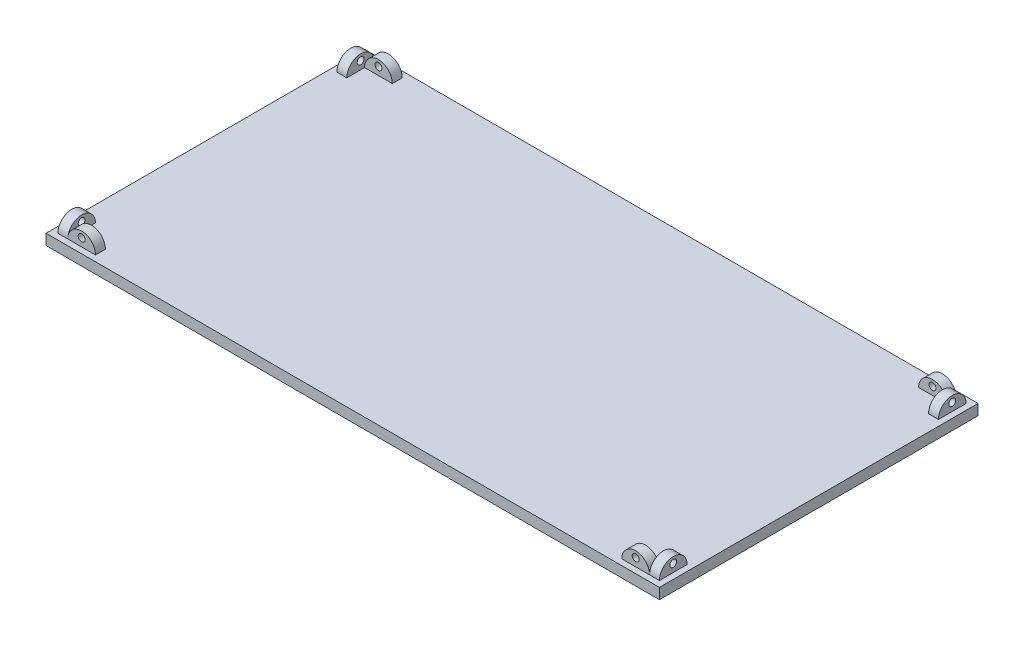
ISO-10303-21;
HEADER;
FILE_DESCRIPTION(('STEP AP214'),'2;1');
FILE_NAME('part.step','',(''),(''),'','','');
FILE_SCHEMA(('AUTOMOTIVE_DESIGN { 1 0 10303 214 1 1 1 1 }'));
ENDSEC;
DATA;
#1=APPLICATION_CONTEXT('core data for automotive mechanical design processes');
#2=APPLICATION_PROTOCOL_DEFINITION('international standard','automotive_design',2000,#1);
#3=PRODUCT_CONTEXT('',#1,'mechanical');
#4=PRODUCT('Part','Part','',(#3));
#5=PRODUCT_RELATED_PRODUCT_CATEGORY('part','',(#4));
#6=PRODUCT_DEFINITION_FORMATION('','',#4);
#7=PRODUCT_DEFINITION_CONTEXT('part definition',#1,'design');
#8=PRODUCT_DEFINITION('design','',#6,#7);
#9=PRODUCT_DEFINITION_SHAPE('','',#8);
#10=(LENGTH_UNIT() NAMED_UNIT(*) SI_UNIT(.MILLI.,.METRE.));
#11=(NAMED_UNIT(*) PLANE_ANGLE_UNIT() SI_UNIT($,.RADIAN.));
#12=(NAMED_UNIT(*) SI_UNIT($,.STERADIAN.) SOLID_ANGLE_UNIT());
#13=UNCERTAINTY_MEASURE_WITH_UNIT(LENGTH_MEASURE(1.E-05),#10,'distance_accuracy_value','');
#14=(GEOMETRIC_REPRESENTATION_CONTEXT(3) GLOBAL_UNCERTAINTY_ASSIGNED_CONTEXT((#13)) GLOBAL_UNIT_ASSIGNED_CONTEXT((#10,
#11,#12)) REPRESENTATION_CONTEXT('',''));
#15=CARTESIAN_POINT('',(0.,0.,0.));
#16=DIRECTION('',(0.,0.,1.));
#17=DIRECTION('',(1.,0.,0.));
#18=AXIS2_PLACEMENT_3D('',#15,#16,#17);
#19=CARTESIAN_POINT('',(0.,0.,0.));
#20=DIRECTION('',(0.,-1.,0.));
#21=DIRECTION('',(0.,0.,-1.));
#22=AXIS2_PLACEMENT_3D('',#19,#20,#21);
#23=PLANE('',#22);
#24=DIRECTION('',(-1.,0.,0.));
#25=VECTOR('',#24,1.);
#26=CARTESIAN_POINT('',(1.87123665779043,0.,-71.114281477171));
#27=LINE('',#26,#25);
#28=CARTESIAN_POINT('',(147.935618328895,0.,-71.114281477171));
#29=VERTEX_POINT('',#28);
#30=CARTESIAN_POINT('',(133.935618328895,0.,-71.114281477171));
#31=VERTEX_POINT('',#30);
#32=EDGE_CURVE('E551',#29,#31,#27,.T.);
#33=ORIENTED_EDGE('',*,*,#32,.T.);
#34=DIRECTION('',(0.,0.,-1.));
#35=VECTOR('',#34,1.);
#36=CARTESIAN_POINT('',(133.935618328895,0.,-71.114281477171));
#37=LINE('',#36,#35);
#38=CARTESIAN_POINT('',(133.935618328895,0.,-76.1142814771711));
#39=VERTEX_POINT('',#38);
#40=EDGE_CURVE('E565',#31,#39,#37,.T.);
#41=ORIENTED_EDGE('',*,*,#40,.T.);
#42=DIRECTION('',(-1.,0.,0.));
#43=VECTOR('',#42,1.);
#44=CARTESIAN_POINT('',(1.87123665779043,0.,-76.1142814771711));
#45=LINE('',#44,#43);
#46=CARTESIAN_POINT('',(147.935618328895,0.,-76.1142814771711));
#47=VERTEX_POINT('',#46);
#48=EDGE_CURVE('E547',#47,#39,#45,.T.);
#49=ORIENTED_EDGE('',*,*,#48,.F.);
#50=DIRECTION('',(1.,0.,0.));
#51=VECTOR('',#50,1.);
#52=CARTESIAN_POINT('',(147.935618328895,0.,-76.1142814771709));
#53=LINE('',#52,#51);
#54=CARTESIAN_POINT('',(152.935618328895,0.,-76.1142814771709));
#55=VERTEX_POINT('',#54);
#56=EDGE_CURVE('E599',#47,#55,#53,.T.);
#57=ORIENTED_EDGE('',*,*,#56,.T.);
#58=DIRECTION('',(0.,0.,-1.));
#59=VECTOR('',#58,1.);
#60=CARTESIAN_POINT('',(152.935618328895,0.,-62.1142814771709));
#61=LINE('',#60,#59);
#62=CARTESIAN_POINT('',(152.935618328895,0.,-62.1142814771709));
#63=VERTEX_POINT('',#62);
#64=EDGE_CURVE('E585',#63,#55,#61,.T.);
#65=ORIENTED_EDGE('',*,*,#64,.F.);
#66=DIRECTION('',(1.,0.,0.));
#67=VECTOR('',#66,1.);
#68=CARTESIAN_POINT('',(147.935618328895,0.,-62.1142814771709));
#69=LINE('',#68,#67);
#70=CARTESIAN_POINT('',(147.935618328895,0.,-62.1142814771709));
#71=VERTEX_POINT('',#70);
#72=EDGE_CURVE('E589',#71,#63,#69,.T.);
#73=ORIENTED_EDGE('',*,*,#72,.F.);
#74=DIRECTION('',(0.,0.,-1.));
#75=VECTOR('',#74,1.);
#76=CARTESIAN_POINT('',(147.935618328895,0.,-62.1142814771709));
#77=LINE('',#76,#75);
#78=EDGE_CURVE('E584',#71,#29,#77,.T.);
#79=ORIENTED_EDGE('',*,*,#78,.T.);
#80=EDGE_LOOP('',(#33,#41,#49,#57,#65,#73,#79));
#81=FACE_BOUND('',#80,.T.);
#82=DIRECTION('',(1.,0.,0.));
#83=VECTOR('',#82,1.);
#84=CARTESIAN_POINT('',(0.,0.,73.8857185228291));
#85=LINE('',#84,#83);
#86=CARTESIAN_POINT('',(-146.064381671105,0.,73.8857185228291));
#87=VERTEX_POINT('',#86);
#88=CARTESIAN_POINT('',(-132.064381671105,0.,73.8857185228291));
#89=VERTEX_POINT('',#88);
#90=EDGE_CURVE('E250',#87,#89,#85,.T.);
#91=ORIENTED_EDGE('',*,*,#90,.T.);
#92=DIRECTION('',(0.,0.,1.));
#93=VECTOR('',#92,1.);
#94=CARTESIAN_POINT('',(-132.064381671105,0.,73.8857185228291));
#95=LINE('',#94,#93);
#96=CARTESIAN_POINT('',(-132.064381671105,0.,78.8857185228291));
#97=VERTEX_POINT('',#96);
#98=EDGE_CURVE('E254',#89,#97,#95,.T.);
#99=ORIENTED_EDGE('',*,*,#98,.T.);
#100=DIRECTION('',(1.,0.,0.));
#101=VECTOR('',#100,1.);
#102=CARTESIAN_POINT('',(0.,0.,78.8857185228291));
#103=LINE('',#102,#101);
#104=CARTESIAN_POINT('',(-146.064381671105,0.,78.8857185228291));
#105=VERTEX_POINT('',#104);
#106=EDGE_CURVE('E246',#105,#97,#103,.T.);
#107=ORIENTED_EDGE('',*,*,#106,.F.);
#108=DIRECTION('',(-1.,0.,0.));
#109=VECTOR('',#108,1.);
#110=CARTESIAN_POINT('',(-146.064381671105,0.,78.8857185228291));
#111=LINE('',#110,#109);
#112=CARTESIAN_POINT('',(-151.064381671105,0.,78.8857185228291));
#113=VERTEX_POINT('',#112);
#114=EDGE_CURVE('E326',#105,#113,#111,.T.);
#115=ORIENTED_EDGE('',*,*,#114,.T.);
#116=DIRECTION('',(0.,0.,-1.));
#117=VECTOR('',#116,1.);
#118=CARTESIAN_POINT('',(-151.064381671105,0.,78.8857185228291));
#119=LINE('',#118,#117);
#120=CARTESIAN_POINT('',(-151.064381671105,0.,64.8857185228291));
#121=VERTEX_POINT('',#120);
#122=EDGE_CURVE('E312',#113,#121,#119,.T.);
#123=ORIENTED_EDGE('',*,*,#122,.T.);
#124=DIRECTION('',(-1.,0.,0.));
#125=VECTOR('',#124,1.);
#126=CARTESIAN_POINT('',(-146.064381671105,0.,64.8857185228291));
#127=LINE('',#126,#125);
#128=CARTESIAN_POINT('',(-146.064381671105,0.,64.8857185228291));
#129=VERTEX_POINT('',#128);
#130=EDGE_CURVE('E317',#129,#121,#127,.T.);
#131=ORIENTED_EDGE('',*,*,#130,.F.);
#132=DIRECTION('',(0.,0.,-1.));
#133=VECTOR('',#132,1.);
#134=CARTESIAN_POINT('',(-146.064381671105,0.,78.8857185228291));
#135=LINE('',#134,#133);
#136=EDGE_CURVE('E311',#87,#129,#135,.T.);
#137=ORIENTED_EDGE('',*,*,#136,.F.);
#138=EDGE_LOOP('',(#91,#99,#107,#115,#123,#131,#137));
#139=FACE_BOUND('',#138,.T.);
#140=DIRECTION('',(0.,0.,1.));
#141=VECTOR('',#140,1.);
#142=CARTESIAN_POINT('',(-154.064381671105,0.,81.8857185228291));
#143=LINE('',#142,#141);
#144=CARTESIAN_POINT('',(-154.064381671105,0.,-79.1142814771709));
#145=VERTEX_POINT('',#144);
#146=CARTESIAN_POINT('',(-154.064381671105,0.,81.8857185228291));
#147=VERTEX_POINT('',#146);
#148=EDGE_CURVE('E329',#145,#147,#143,.T.);
#149=ORIENTED_EDGE('',*,*,#148,.T.);
#150=DIRECTION('',(1.,0.,0.));
#151=VECTOR('',#150,1.);
#152=CARTESIAN_POINT('',(-154.064381671105,0.,81.8857185228291));
#153=LINE('',#152,#151);
#154=CARTESIAN_POINT('',(155.935618328895,0.,81.8857185228292));
#155=VERTEX_POINT('',#154);
#156=EDGE_CURVE('E350',#147,#155,#153,.T.);
#157=ORIENTED_EDGE('',*,*,#156,.T.);
#158=DIRECTION('',(0.,0.,-1.));
#159=VECTOR('',#158,1.);
#160=CARTESIAN_POINT('',(155.935618328895,0.,81.8857185228292));
#161=LINE('',#160,#159);
#162=CARTESIAN_POINT('',(155.935618328895,0.,-79.114281477171));
#163=VERTEX_POINT('',#162);
#164=EDGE_CURVE('E354',#155,#163,#161,.T.);
#165=ORIENTED_EDGE('',*,*,#164,.T.);
#166=DIRECTION('',(-1.,0.,0.));
#167=VECTOR('',#166,1.);
#168=CARTESIAN_POINT('',(-154.064381671105,0.,-79.1142814771709));
#169=LINE('',#168,#167);
#170=EDGE_CURVE('E335',#163,#145,#169,.T.);
#171=ORIENTED_EDGE('',*,*,#170,.T.);
#172=EDGE_LOOP('',(#149,#157,#165,#171));
#173=FACE_BOUND('',#172,.T.);
#174=DIRECTION('',(1.,0.,0.));
#175=VECTOR('',#174,1.);
#176=CARTESIAN_POINT('',(0.,0.,-71.114281477171));
#177=LINE('',#176,#175);
#178=CARTESIAN_POINT('',(-146.064381671105,0.,-71.114281477171));
#179=VERTEX_POINT('',#178);
#180=CARTESIAN_POINT('',(-132.064381671105,0.,-71.114281477171));
#181=VERTEX_POINT('',#180);
#182=EDGE_CURVE('E221',#179,#181,#177,.T.);
#183=ORIENTED_EDGE('',*,*,#182,.F.);
#184=DIRECTION('',(0.,0.,-1.));
#185=VECTOR('',#184,1.);
#186=CARTESIAN_POINT('',(-146.064381671105,0.,-62.1142814771709));
#187=LINE('',#186,#185);
#188=CARTESIAN_POINT('',(-146.064381671105,0.,-62.1142814771709));
#189=VERTEX_POINT('',#188);
#190=EDGE_CURVE('E281',#189,#179,#187,.T.);
#191=ORIENTED_EDGE('',*,*,#190,.F.);
#192=DIRECTION('',(-1.,0.,0.));
#193=VECTOR('',#192,1.);
#194=CARTESIAN_POINT('',(-146.064381671105,0.,-62.1142814771709));
#195=LINE('',#194,#193);
#196=CARTESIAN_POINT('',(-151.064381671105,0.,-62.1142814771709));
#197=VERTEX_POINT('',#196);
#198=EDGE_CURVE('E295',#189,#197,#195,.T.);
#199=ORIENTED_EDGE('',*,*,#198,.T.);
#200=DIRECTION('',(0.,0.,-1.));
#201=VECTOR('',#200,1.);
#202=CARTESIAN_POINT('',(-151.064381671105,0.,-62.1142814771709));
#203=LINE('',#202,#201);
#204=CARTESIAN_POINT('',(-151.064381671105,0.,-76.1142814771709));
#205=VERTEX_POINT('',#204);
#206=EDGE_CURVE('E282',#197,#205,#203,.T.);
#207=ORIENTED_EDGE('',*,*,#206,.T.);
#208=DIRECTION('',(-1.,0.,0.));
#209=VECTOR('',#208,1.);
#210=CARTESIAN_POINT('',(-146.064381671105,0.,-76.1142814771709));
#211=LINE('',#210,#209);
#212=CARTESIAN_POINT('',(-146.064381671105,0.,-76.1142814771709));
#213=VERTEX_POINT('',#212);
#214=EDGE_CURVE('E286',#213,#205,#211,.T.);
#215=ORIENTED_EDGE('',*,*,#214,.F.);
#216=DIRECTION('',(1.,0.,0.));
#217=VECTOR('',#216,1.);
#218=CARTESIAN_POINT('',(0.,0.,-76.1142814771711));
#219=LINE('',#218,#217);
#220=CARTESIAN_POINT('',(-132.064381671105,0.,-76.1142814771711));
#221=VERTEX_POINT('',#220);
#222=EDGE_CURVE('E218',#213,#221,#219,.T.);
#223=ORIENTED_EDGE('',*,*,#222,.T.);
#224=DIRECTION('',(0.,0.,-1.));
#225=VECTOR('',#224,1.);
#226=CARTESIAN_POINT('',(-132.064381671105,0.,-71.114281477171));
#227=LINE('',#226,#225);
#228=EDGE_CURVE('E224',#181,#221,#227,.T.);
#229=ORIENTED_EDGE('',*,*,#228,.F.);
#230=EDGE_LOOP('',(#183,#191,#199,#207,#215,#223,#229));
#231=FACE_BOUND('',#230,.T.);
#232=DIRECTION('',(-1.,0.,0.));
#233=VECTOR('',#232,1.);
#234=CARTESIAN_POINT('',(1.87123665779043,0.,73.8857185228291));
#235=LINE('',#234,#233);
#236=CARTESIAN_POINT('',(147.935618328895,0.,73.8857185228291));
#237=VERTEX_POINT('',#236);
#238=CARTESIAN_POINT('',(133.935618328895,0.,73.8857185228291));
#239=VERTEX_POINT('',#238);
#240=EDGE_CURVE('E176',#237,#239,#235,.T.);
#241=ORIENTED_EDGE('',*,*,#240,.F.);
#242=DIRECTION('',(0.,0.,-1.));
#243=VECTOR('',#242,1.);
#244=CARTESIAN_POINT('',(147.935618328895,0.,78.8857185228291));
#245=LINE('',#244,#243);
#246=CARTESIAN_POINT('',(147.935618328895,0.,64.8857185228291));
#247=VERTEX_POINT('',#246);
#248=EDGE_CURVE('E167',#237,#247,#245,.T.);
#249=ORIENTED_EDGE('',*,*,#248,.T.);
#250=DIRECTION('',(1.,0.,0.));
#251=VECTOR('',#250,1.);
#252=CARTESIAN_POINT('',(147.935618328895,0.,64.8857185228291));
#253=LINE('',#252,#251);
#254=CARTESIAN_POINT('',(152.935618328895,0.,64.8857185228291));
#255=VERTEX_POINT('',#254);
#256=EDGE_CURVE('E196',#247,#255,#253,.T.);
#257=ORIENTED_EDGE('',*,*,#256,.T.);
#258=DIRECTION('',(0.,0.,-1.));
#259=VECTOR('',#258,1.);
#260=CARTESIAN_POINT('',(152.935618328895,0.,78.8857185228291));
#261=LINE('',#260,#259);
#262=CARTESIAN_POINT('',(152.935618328895,0.,78.8857185228291));
#263=VERTEX_POINT('',#262);
#264=EDGE_CURVE('E205',#263,#255,#261,.T.);
#265=ORIENTED_EDGE('',*,*,#264,.F.);
#266=DIRECTION('',(1.,0.,0.));
#267=VECTOR('',#266,1.);
#268=CARTESIAN_POINT('',(147.935618328895,0.,78.8857185228291));
#269=LINE('',#268,#267);
#270=CARTESIAN_POINT('',(147.935618328895,0.,78.8857185228291));
#271=VERTEX_POINT('',#270);
#272=EDGE_CURVE('E193',#271,#263,#269,.T.);
#273=ORIENTED_EDGE('',*,*,#272,.F.);
#274=DIRECTION('',(-1.,0.,0.));
#275=VECTOR('',#274,1.);
#276=CARTESIAN_POINT('',(1.87123665779043,0.,78.8857185228291));
#277=LINE('',#276,#275);
#278=CARTESIAN_POINT('',(133.935618328895,0.,78.8857185228291));
#279=VERTEX_POINT('',#278);
#280=EDGE_CURVE('E64',#271,#279,#277,.T.);
#281=ORIENTED_EDGE('',*,*,#280,.T.);
#282=DIRECTION('',(0.,0.,1.));
#283=VECTOR('',#282,1.);
#284=CARTESIAN_POINT('',(133.935618328895,0.,73.8857185228291));
#285=LINE('',#284,#283);
#286=EDGE_CURVE('E59',#239,#279,#285,.T.);
#287=ORIENTED_EDGE('',*,*,#286,.F.);
#288=EDGE_LOOP('',(#241,#249,#257,#265,#273,#281,#287));
#289=FACE_BOUND('',#288,.T.);
#290=ADVANCED_FACE('F41',(#81,#139,#173,#231,#289),#23,.F.);
#291=CARTESIAN_POINT('',(-154.064381671105,-5.4,81.8857185228291));
#292=DIRECTION('',(-1.,0.,0.));
#293=DIRECTION('',(0.,0.,1.));
#294=AXIS2_PLACEMENT_3D('',#291,#292,#293);
#295=PLANE('',#294);
#296=ORIENTED_EDGE('',*,*,#148,.F.);
#297=DIRECTION('',(0.,1.,0.));
#298=VECTOR('',#297,1.);
#299=CARTESIAN_POINT('',(-154.064381671105,-5.4,-79.1142814771709));
#300=LINE('',#299,#298);
#301=CARTESIAN_POINT('',(-154.064381671105,-5.4,-79.1142814771709));
#302=VERTEX_POINT('',#301);
#303=EDGE_CURVE('E11',#302,#145,#300,.T.);
#304=ORIENTED_EDGE('',*,*,#303,.F.);
#305=DIRECTION('',(0.,0.,1.));
#306=VECTOR('',#305,1.);
#307=CARTESIAN_POINT('',(-154.064381671105,-5.4,81.8857185228291));
#308=LINE('',#307,#306);
#309=CARTESIAN_POINT('',(-154.064381671105,-5.4,81.8857185228291));
#310=VERTEX_POINT('',#309);
#311=EDGE_CURVE('E330',#302,#310,#308,.T.);
#312=ORIENTED_EDGE('',*,*,#311,.T.);
#313=DIRECTION('',(0.,1.,0.));
#314=VECTOR('',#313,1.);
#315=CARTESIAN_POINT('',(-154.064381671105,-5.4,81.8857185228291));
#316=LINE('',#315,#314);
#317=EDGE_CURVE('E45',#310,#147,#316,.T.);
#318=ORIENTED_EDGE('',*,*,#317,.T.);
#319=EDGE_LOOP('',(#296,#304,#312,#318));
#320=FACE_BOUND('',#319,.T.);
#321=ADVANCED_FACE('F43',(#320),#295,.T.);
#322=CARTESIAN_POINT('',(-154.064381671105,-5.4,-79.1142814771709));
#323=DIRECTION('',(0.,0.,-1.));
#324=DIRECTION('',(-1.,0.,0.));
#325=AXIS2_PLACEMENT_3D('',#322,#323,#324);
#326=PLANE('',#325);
#327=ORIENTED_EDGE('',*,*,#170,.F.);
#328=DIRECTION('',(0.,1.,0.));
#329=VECTOR('',#328,1.);
#330=CARTESIAN_POINT('',(155.935618328895,-5.4,-79.114281477171));
#331=LINE('',#330,#329);
#332=CARTESIAN_POINT('',(155.935618328895,-5.4,-79.114281477171));
#333=VERTEX_POINT('',#332);
#334=EDGE_CURVE('E51',#333,#163,#331,.T.);
#335=ORIENTED_EDGE('',*,*,#334,.F.);
#336=DIRECTION('',(-1.,0.,0.));
#337=VECTOR('',#336,1.);
#338=CARTESIAN_POINT('',(-154.064381671105,-5.4,-79.1142814771709));
#339=LINE('',#338,#337);
#340=EDGE_CURVE('E343',#333,#302,#339,.T.);
#341=ORIENTED_EDGE('',*,*,#340,.T.);
#342=ORIENTED_EDGE('',*,*,#303,.T.);
#343=EDGE_LOOP('',(#327,#335,#341,#342));
#344=FACE_BOUND('',#343,.T.);
#345=ADVANCED_FACE('F377',(#344),#326,.T.);
#346=CARTESIAN_POINT('',(155.935618328895,-5.4,81.8857185228292));
#347=DIRECTION('',(1.,0.,0.));
#348=DIRECTION('',(0.,0.,-1.));
#349=AXIS2_PLACEMENT_3D('',#346,#347,#348);
#350=PLANE('',#349);
#351=ORIENTED_EDGE('',*,*,#164,.F.);
#352=DIRECTION('',(0.,1.,0.));
#353=VECTOR('',#352,1.);
#354=CARTESIAN_POINT('',(155.935618328895,-5.4,81.8857185228292));
#355=LINE('',#354,#353);
#356=CARTESIAN_POINT('',(155.935618328895,-5.4,81.8857185228292));
#357=VERTEX_POINT('',#356);
#358=EDGE_CURVE('E362',#357,#155,#355,.T.);
#359=ORIENTED_EDGE('',*,*,#358,.F.);
#360=DIRECTION('',(0.,0.,-1.));
#361=VECTOR('',#360,1.);
#362=CARTESIAN_POINT('',(155.935618328895,-5.4,81.8857185228292));
#363=LINE('',#362,#361);
#364=EDGE_CURVE('E339',#357,#333,#363,.T.);
#365=ORIENTED_EDGE('',*,*,#364,.T.);
#366=ORIENTED_EDGE('',*,*,#334,.T.);
#367=EDGE_LOOP('',(#351,#359,#365,#366));
#368=FACE_BOUND('',#367,.T.);
#369=ADVANCED_FACE('F383',(#368),#350,.T.);
#370=CARTESIAN_POINT('',(-154.064381671105,-5.4,81.8857185228291));
#371=DIRECTION('',(0.,0.,1.));
#372=DIRECTION('',(1.,0.,0.));
#373=AXIS2_PLACEMENT_3D('',#370,#371,#372);
#374=PLANE('',#373);
#375=ORIENTED_EDGE('',*,*,#156,.F.);
#376=ORIENTED_EDGE('',*,*,#317,.F.);
#377=DIRECTION('',(1.,0.,0.));
#378=VECTOR('',#377,1.);
#379=CARTESIAN_POINT('',(-154.064381671105,-5.4,81.8857185228291));
#380=LINE('',#379,#378);
#381=EDGE_CURVE('E334',#310,#357,#380,.T.);
#382=ORIENTED_EDGE('',*,*,#381,.T.);
#383=ORIENTED_EDGE('',*,*,#358,.T.);
#384=EDGE_LOOP('',(#375,#376,#382,#383));
#385=FACE_BOUND('',#384,.T.);
#386=ADVANCED_FACE('F372',(#385),#374,.T.);
#387=CARTESIAN_POINT('',(0.,-5.4,0.));
#388=DIRECTION('',(0.,-1.,0.));
#389=DIRECTION('',(0.,0.,-1.));
#390=AXIS2_PLACEMENT_3D('',#387,#388,#389);
#391=PLANE('',#390);
#392=ORIENTED_EDGE('',*,*,#311,.F.);
#393=ORIENTED_EDGE('',*,*,#340,.F.);
#394=ORIENTED_EDGE('',*,*,#364,.F.);
#395=ORIENTED_EDGE('',*,*,#381,.F.);
#396=EDGE_LOOP('',(#392,#393,#394,#395));
#397=FACE_BOUND('',#396,.T.);
#398=ADVANCED_FACE('F380',(#397),#391,.T.);
#399=CARTESIAN_POINT('',(-146.064381671105,0.,71.8857185228291));
#400=DIRECTION('',(1.,0.,0.));
#401=DIRECTION('',(0.,0.,-1.));
#402=AXIS2_PLACEMENT_3D('',#399,#400,#401);
#403=PLANE('',#402);
#404=CARTESIAN_POINT('',(-146.064381671105,0.,71.8857185228291));
#405=DIRECTION('',(1.,0.,0.));
#406=DIRECTION('',(0.,0.,-1.));
#407=AXIS2_PLACEMENT_3D('',#404,#405,#406);
#408=CIRCLE('',#407,7.);
#409=EDGE_CURVE('E307',#129,#105,#408,.T.);
#410=ORIENTED_EDGE('',*,*,#409,.T.);
#411=EDGE_CURVE('E313',#105,#87,#135,.T.);
#412=ORIENTED_EDGE('',*,*,#411,.T.);
#413=ORIENTED_EDGE('',*,*,#136,.T.);
#414=EDGE_LOOP('',(#410,#412,#413));
#415=FACE_BOUND('',#414,.T.);
#416=CARTESIAN_POINT('',(-146.064381671105,4.,71.8857185228291));
#417=DIRECTION('',(1.,0.,0.));
#418=DIRECTION('',(0.,0.,-1.));
#419=AXIS2_PLACEMENT_3D('',#416,#417,#418);
#420=CIRCLE('',#419,1.75);
#421=CARTESIAN_POINT('',(-146.064381671105,4.,70.1357185228291));
#422=VERTEX_POINT('',#421);
#423=EDGE_CURVE('E299',#422,#422,#420,.T.);
#424=ORIENTED_EDGE('',*,*,#423,.F.);
#425=EDGE_LOOP('',(#424));
#426=FACE_BOUND('',#425,.T.);
#427=ADVANCED_FACE('F401',(#415,#426),#403,.T.);
#428=CARTESIAN_POINT('',(-151.064381671105,0.,71.8857185228291));
#429=DIRECTION('',(1.,0.,0.));
#430=DIRECTION('',(0.,0.,-1.));
#431=AXIS2_PLACEMENT_3D('',#428,#429,#430);
#432=PLANE('',#431);
#433=CARTESIAN_POINT('',(-151.064381671105,0.,71.8857185228291));
#434=DIRECTION('',(1.,0.,0.));
#435=DIRECTION('',(0.,0.,-1.));
#436=AXIS2_PLACEMENT_3D('',#433,#434,#435);
#437=CIRCLE('',#436,7.);
#438=EDGE_CURVE('E303',#121,#113,#437,.T.);
#439=ORIENTED_EDGE('',*,*,#438,.F.);
#440=ORIENTED_EDGE('',*,*,#122,.F.);
#441=EDGE_LOOP('',(#439,#440));
#442=FACE_BOUND('',#441,.T.);
#443=CARTESIAN_POINT('',(-151.064381671105,4.,71.8857185228291));
#444=DIRECTION('',(1.,0.,0.));
#445=DIRECTION('',(0.,0.,-1.));
#446=AXIS2_PLACEMENT_3D('',#443,#444,#445);
#447=CIRCLE('',#446,1.75);
#448=CARTESIAN_POINT('',(-151.064381671105,4.,70.1357185228291));
#449=VERTEX_POINT('',#448);
#450=EDGE_CURVE('E298',#449,#449,#447,.T.);
#451=ORIENTED_EDGE('',*,*,#450,.T.);
#452=EDGE_LOOP('',(#451));
#453=FACE_BOUND('',#452,.T.);
#454=ADVANCED_FACE('F406',(#442,#453),#432,.F.);
#455=CARTESIAN_POINT('',(-146.064381671105,0.,71.8857185228291));
#456=DIRECTION('',(-1.,0.,0.));
#457=DIRECTION('',(0.,0.,1.));
#458=AXIS2_PLACEMENT_3D('',#455,#456,#457);
#459=CYLINDRICAL_SURFACE('',#458,7.);
#460=ORIENTED_EDGE('',*,*,#438,.T.);
#461=ORIENTED_EDGE('',*,*,#114,.F.);
#462=ORIENTED_EDGE('',*,*,#409,.F.);
#463=ORIENTED_EDGE('',*,*,#130,.T.);
#464=EDGE_LOOP('',(#460,#461,#462,#463));
#465=FACE_BOUND('',#464,.T.);
#466=ADVANCED_FACE('F402',(#465),#459,.T.);
#467=CARTESIAN_POINT('',(-146.064381671105,4.,71.8857185228291));
#468=DIRECTION('',(-1.,0.,0.));
#469=DIRECTION('',(0.,0.,1.));
#470=AXIS2_PLACEMENT_3D('',#467,#468,#469);
#471=CYLINDRICAL_SURFACE('',#470,1.75);
#472=ORIENTED_EDGE('',*,*,#423,.T.);
#473=EDGE_LOOP('',(#472));
#474=FACE_BOUND('',#473,.T.);
#475=ORIENTED_EDGE('',*,*,#450,.F.);
#476=EDGE_LOOP('',(#475));
#477=FACE_BOUND('',#476,.T.);
#478=ADVANCED_FACE('F405',(#474,#477),#471,.F.);
#479=CARTESIAN_POINT('',(-146.064381671105,0.,-69.1142814771709));
#480=DIRECTION('',(1.,0.,0.));
#481=DIRECTION('',(0.,0.,-1.));
#482=AXIS2_PLACEMENT_3D('',#479,#480,#481);
#483=PLANE('',#482);
#484=CARTESIAN_POINT('',(-146.064381671105,0.,-69.1142814771709));
#485=DIRECTION('',(1.,0.,0.));
#486=DIRECTION('',(0.,0.,-1.));
#487=AXIS2_PLACEMENT_3D('',#484,#485,#486);
#488=CIRCLE('',#487,7.);
#489=EDGE_CURVE('E277',#213,#189,#488,.T.);
#490=ORIENTED_EDGE('',*,*,#489,.T.);
#491=ORIENTED_EDGE('',*,*,#190,.T.);
#492=DIRECTION('',(0.,0.,-1.));
#493=VECTOR('',#492,1.);
#494=CARTESIAN_POINT('',(-146.064381671105,0.,-71.114281477171));
#495=LINE('',#494,#493);
#496=EDGE_CURVE('E234',#179,#213,#495,.T.);
#497=ORIENTED_EDGE('',*,*,#496,.T.);
#498=EDGE_LOOP('',(#490,#491,#497));
#499=FACE_BOUND('',#498,.T.);
#500=CARTESIAN_POINT('',(-146.064381671105,4.,-69.1142814771709));
#501=DIRECTION('',(1.,0.,0.));
#502=DIRECTION('',(0.,0.,-1.));
#503=AXIS2_PLACEMENT_3D('',#500,#501,#502);
#504=CIRCLE('',#503,1.75);
#505=CARTESIAN_POINT('',(-146.064381671105,4.,-70.8642814771709));
#506=VERTEX_POINT('',#505);
#507=EDGE_CURVE('E269',#506,#506,#504,.T.);
#508=ORIENTED_EDGE('',*,*,#507,.F.);
#509=EDGE_LOOP('',(#508));
#510=FACE_BOUND('',#509,.T.);
#511=ADVANCED_FACE('F416',(#499,#510),#483,.T.);
#512=CARTESIAN_POINT('',(-151.064381671105,0.,-69.1142814771709));
#513=DIRECTION('',(1.,0.,0.));
#514=DIRECTION('',(0.,0.,-1.));
#515=AXIS2_PLACEMENT_3D('',#512,#513,#514);
#516=PLANE('',#515);
#517=CARTESIAN_POINT('',(-151.064381671105,0.,-69.1142814771709));
#518=DIRECTION('',(1.,0.,0.));
#519=DIRECTION('',(0.,0.,-1.));
#520=AXIS2_PLACEMENT_3D('',#517,#518,#519);
#521=CIRCLE('',#520,7.);
#522=EDGE_CURVE('E273',#205,#197,#521,.T.);
#523=ORIENTED_EDGE('',*,*,#522,.F.);
#524=ORIENTED_EDGE('',*,*,#206,.F.);
#525=EDGE_LOOP('',(#523,#524));
#526=FACE_BOUND('',#525,.T.);
#527=CARTESIAN_POINT('',(-151.064381671105,4.,-69.1142814771709));
#528=DIRECTION('',(1.,0.,0.));
#529=DIRECTION('',(0.,0.,-1.));
#530=AXIS2_PLACEMENT_3D('',#527,#528,#529);
#531=CIRCLE('',#530,1.75);
#532=CARTESIAN_POINT('',(-151.064381671105,4.,-70.8642814771709));
#533=VERTEX_POINT('',#532);
#534=EDGE_CURVE('E268',#533,#533,#531,.T.);
#535=ORIENTED_EDGE('',*,*,#534,.T.);
#536=EDGE_LOOP('',(#535));
#537=FACE_BOUND('',#536,.T.);
#538=ADVANCED_FACE('F422',(#526,#537),#516,.F.);
#539=CARTESIAN_POINT('',(-146.064381671105,0.,-69.1142814771709));
#540=DIRECTION('',(-1.,0.,0.));
#541=DIRECTION('',(0.,0.,1.));
#542=AXIS2_PLACEMENT_3D('',#539,#540,#541);
#543=CYLINDRICAL_SURFACE('',#542,7.);
#544=ORIENTED_EDGE('',*,*,#522,.T.);
#545=ORIENTED_EDGE('',*,*,#198,.F.);
#546=ORIENTED_EDGE('',*,*,#489,.F.);
#547=ORIENTED_EDGE('',*,*,#214,.T.);
#548=EDGE_LOOP('',(#544,#545,#546,#547));
#549=FACE_BOUND('',#548,.T.);
#550=ADVANCED_FACE('F418',(#549),#543,.T.);
#551=CARTESIAN_POINT('',(-146.064381671105,4.,-69.1142814771709));
#552=DIRECTION('',(-1.,0.,0.));
#553=DIRECTION('',(0.,0.,1.));
#554=AXIS2_PLACEMENT_3D('',#551,#552,#553);
#555=CYLINDRICAL_SURFACE('',#554,1.75);
#556=ORIENTED_EDGE('',*,*,#507,.T.);
#557=EDGE_LOOP('',(#556));
#558=FACE_BOUND('',#557,.T.);
#559=ORIENTED_EDGE('',*,*,#534,.F.);
#560=EDGE_LOOP('',(#559));
#561=FACE_BOUND('',#560,.T.);
#562=ADVANCED_FACE('F421',(#558,#561),#555,.F.);
#563=CARTESIAN_POINT('',(-139.064381671105,0.,73.8857185228291));
#564=DIRECTION('',(0.,0.,1.));
#565=DIRECTION('',(1.,0.,0.));
#566=AXIS2_PLACEMENT_3D('',#563,#564,#565);
#567=CYLINDRICAL_SURFACE('',#566,7.00000000000001);
#568=CARTESIAN_POINT('',(-139.064381671105,0.,78.8857185228291));
#569=DIRECTION('',(0.,0.,1.));
#570=DIRECTION('',(1.,0.,0.));
#571=AXIS2_PLACEMENT_3D('',#568,#569,#570);
#572=CIRCLE('',#571,7.00000000000001);
#573=EDGE_CURVE('E258',#97,#105,#572,.T.);
#574=ORIENTED_EDGE('',*,*,#573,.F.);
#575=ORIENTED_EDGE('',*,*,#98,.F.);
#576=CARTESIAN_POINT('',(-139.064381671105,0.,73.8857185228291));
#577=DIRECTION('',(0.,0.,1.));
#578=DIRECTION('',(1.,0.,0.));
#579=AXIS2_PLACEMENT_3D('',#576,#577,#578);
#580=CIRCLE('',#579,7.00000000000001);
#581=EDGE_CURVE('E245',#89,#87,#580,.T.);
#582=ORIENTED_EDGE('',*,*,#581,.T.);
#583=ORIENTED_EDGE('',*,*,#411,.F.);
#584=EDGE_LOOP('',(#574,#575,#582,#583));
#585=FACE_BOUND('',#584,.T.);
#586=ADVANCED_FACE('F432',(#585),#567,.T.);
#587=CARTESIAN_POINT('',(-139.064381671105,4.,73.8857185228291));
#588=DIRECTION('',(0.,0.,1.));
#589=DIRECTION('',(1.,0.,0.));
#590=AXIS2_PLACEMENT_3D('',#587,#588,#589);
#591=CYLINDRICAL_SURFACE('',#590,1.75000000000001);
#592=CARTESIAN_POINT('',(-139.064381671105,4.,73.8857185228291));
#593=DIRECTION('',(0.,0.,1.));
#594=DIRECTION('',(1.,0.,0.));
#595=AXIS2_PLACEMENT_3D('',#592,#593,#594);
#596=CIRCLE('',#595,1.75000000000001);
#597=CARTESIAN_POINT('',(-137.314381671105,4.,73.8857185228291));
#598=VERTEX_POINT('',#597);
#599=EDGE_CURVE('E241',#598,#598,#596,.T.);
#600=ORIENTED_EDGE('',*,*,#599,.F.);
#601=EDGE_LOOP('',(#600));
#602=FACE_BOUND('',#601,.T.);
#603=CARTESIAN_POINT('',(-139.064381671105,4.,78.8857185228291));
#604=DIRECTION('',(0.,0.,1.));
#605=DIRECTION('',(1.,0.,0.));
#606=AXIS2_PLACEMENT_3D('',#603,#604,#605);
#607=CIRCLE('',#606,1.75000000000001);
#608=CARTESIAN_POINT('',(-137.314381671105,4.,78.8857185228291));
#609=VERTEX_POINT('',#608);
#610=EDGE_CURVE('E238',#609,#609,#607,.T.);
#611=ORIENTED_EDGE('',*,*,#610,.T.);
#612=EDGE_LOOP('',(#611));
#613=FACE_BOUND('',#612,.T.);
#614=ADVANCED_FACE('F434',(#602,#613),#591,.F.);
#615=CARTESIAN_POINT('',(0.,0.,73.8857185228291));
#616=DIRECTION('',(0.,0.,1.));
#617=DIRECTION('',(1.,0.,0.));
#618=AXIS2_PLACEMENT_3D('',#615,#616,#617);
#619=PLANE('',#618);
#620=ORIENTED_EDGE('',*,*,#599,.T.);
#621=EDGE_LOOP('',(#620));
#622=FACE_BOUND('',#621,.T.);
#623=ORIENTED_EDGE('',*,*,#581,.F.);
#624=ORIENTED_EDGE('',*,*,#90,.F.);
#625=EDGE_LOOP('',(#623,#624));
#626=FACE_BOUND('',#625,.T.);
#627=ADVANCED_FACE('F437',(#622,#626),#619,.F.);
#628=CARTESIAN_POINT('',(0.,0.,78.8857185228291));
#629=DIRECTION('',(0.,0.,1.));
#630=DIRECTION('',(1.,0.,0.));
#631=AXIS2_PLACEMENT_3D('',#628,#629,#630);
#632=PLANE('',#631);
#633=ORIENTED_EDGE('',*,*,#610,.F.);
#634=EDGE_LOOP('',(#633));
#635=FACE_BOUND('',#634,.T.);
#636=ORIENTED_EDGE('',*,*,#573,.T.);
#637=ORIENTED_EDGE('',*,*,#106,.T.);
#638=EDGE_LOOP('',(#636,#637));
#639=FACE_BOUND('',#638,.T.);
#640=ADVANCED_FACE('F442',(#635,#639),#632,.T.);
#641=CARTESIAN_POINT('',(-139.064381671105,0.,-71.114281477171));
#642=DIRECTION('',(0.,0.,-1.));
#643=DIRECTION('',(-1.,0.,0.));
#644=AXIS2_PLACEMENT_3D('',#641,#642,#643);
#645=CYLINDRICAL_SURFACE('',#644,7.00000000000001);
#646=CARTESIAN_POINT('',(-139.064381671105,0.,-76.1142814771711));
#647=DIRECTION('',(0.,0.,1.));
#648=DIRECTION('',(1.,0.,0.));
#649=AXIS2_PLACEMENT_3D('',#646,#647,#648);
#650=CIRCLE('',#649,7.00000000000001);
#651=EDGE_CURVE('E228',#221,#213,#650,.T.);
#652=ORIENTED_EDGE('',*,*,#651,.T.);
#653=ORIENTED_EDGE('',*,*,#496,.F.);
#654=CARTESIAN_POINT('',(-139.064381671105,0.,-71.114281477171));
#655=DIRECTION('',(0.,0.,1.));
#656=DIRECTION('',(1.,0.,0.));
#657=AXIS2_PLACEMENT_3D('',#654,#655,#656);
#658=CIRCLE('',#657,7.00000000000001);
#659=EDGE_CURVE('E217',#181,#179,#658,.T.);
#660=ORIENTED_EDGE('',*,*,#659,.F.);
#661=ORIENTED_EDGE('',*,*,#228,.T.);
#662=EDGE_LOOP('',(#652,#653,#660,#661));
#663=FACE_BOUND('',#662,.T.);
#664=ADVANCED_FACE('F445',(#663),#645,.T.);
#665=CARTESIAN_POINT('',(-139.064381671105,4.,-71.114281477171));
#666=DIRECTION('',(0.,0.,-1.));
#667=DIRECTION('',(-1.,0.,0.));
#668=AXIS2_PLACEMENT_3D('',#665,#666,#667);
#669=CYLINDRICAL_SURFACE('',#668,1.75000000000001);
#670=CARTESIAN_POINT('',(-139.064381671105,4.,-71.114281477171));
#671=DIRECTION('',(0.,0.,1.));
#672=DIRECTION('',(1.,0.,0.));
#673=AXIS2_PLACEMENT_3D('',#670,#671,#672);
#674=CIRCLE('',#673,1.75000000000001);
#675=CARTESIAN_POINT('',(-137.314381671105,4.,-71.114281477171));
#676=VERTEX_POINT('',#675);
#677=EDGE_CURVE('E213',#676,#676,#674,.T.);
#678=ORIENTED_EDGE('',*,*,#677,.T.);
#679=EDGE_LOOP('',(#678));
#680=FACE_BOUND('',#679,.T.);
#681=CARTESIAN_POINT('',(-139.064381671105,4.,-76.1142814771711));
#682=DIRECTION('',(0.,0.,1.));
#683=DIRECTION('',(1.,0.,0.));
#684=AXIS2_PLACEMENT_3D('',#681,#682,#683);
#685=CIRCLE('',#684,1.75000000000001);
#686=CARTESIAN_POINT('',(-137.314381671105,4.,-76.1142814771711));
#687=VERTEX_POINT('',#686);
#688=EDGE_CURVE('E212',#687,#687,#685,.T.);
#689=ORIENTED_EDGE('',*,*,#688,.F.);
#690=EDGE_LOOP('',(#689));
#691=FACE_BOUND('',#690,.T.);
#692=ADVANCED_FACE('F450',(#680,#691),#669,.F.);
#693=CARTESIAN_POINT('',(0.,0.,-71.114281477171));
#694=DIRECTION('',(0.,0.,-1.));
#695=DIRECTION('',(1.,0.,0.));
#696=AXIS2_PLACEMENT_3D('',#693,#694,#695);
#697=PLANE('',#696);
#698=ORIENTED_EDGE('',*,*,#677,.F.);
#699=EDGE_LOOP('',(#698));
#700=FACE_BOUND('',#699,.T.);
#701=ORIENTED_EDGE('',*,*,#659,.T.);
#702=ORIENTED_EDGE('',*,*,#182,.T.);
#703=EDGE_LOOP('',(#701,#702));
#704=FACE_BOUND('',#703,.T.);
#705=ADVANCED_FACE('F453',(#700,#704),#697,.F.);
#706=CARTESIAN_POINT('',(0.,0.,-76.1142814771711));
#707=DIRECTION('',(0.,0.,-1.));
#708=DIRECTION('',(1.,0.,0.));
#709=AXIS2_PLACEMENT_3D('',#706,#707,#708);
#710=PLANE('',#709);
#711=ORIENTED_EDGE('',*,*,#688,.T.);
#712=EDGE_LOOP('',(#711));
#713=FACE_BOUND('',#712,.T.);
#714=ORIENTED_EDGE('',*,*,#651,.F.);
#715=ORIENTED_EDGE('',*,*,#222,.F.);
#716=EDGE_LOOP('',(#714,#715));
#717=FACE_BOUND('',#716,.T.);
#718=ADVANCED_FACE('F458',(#713,#717),#710,.T.);
#719=CARTESIAN_POINT('',(147.935618328895,0.,71.8857185228291));
#720=DIRECTION('',(1.,0.,0.));
#721=DIRECTION('',(0.,0.,-1.));
#722=AXIS2_PLACEMENT_3D('',#719,#720,#721);
#723=CYLINDRICAL_SURFACE('',#722,7.);
#724=CARTESIAN_POINT('',(152.935618328895,0.,71.8857185228291));
#725=DIRECTION('',(1.,0.,0.));
#726=DIRECTION('',(0.,0.,-1.));
#727=AXIS2_PLACEMENT_3D('',#724,#725,#726);
#728=CIRCLE('',#727,7.);
#729=EDGE_CURVE('E201',#255,#263,#728,.T.);
#730=ORIENTED_EDGE('',*,*,#729,.F.);
#731=ORIENTED_EDGE('',*,*,#256,.F.);
#732=CARTESIAN_POINT('',(147.935618328895,0.,71.8857185228291));
#733=DIRECTION('',(1.,0.,0.));
#734=DIRECTION('',(0.,0.,-1.));
#735=AXIS2_PLACEMENT_3D('',#732,#733,#734);
#736=CIRCLE('',#735,7.);
#737=EDGE_CURVE('E172',#247,#271,#736,.T.);
#738=ORIENTED_EDGE('',*,*,#737,.T.);
#739=ORIENTED_EDGE('',*,*,#272,.T.);
#740=EDGE_LOOP('',(#730,#731,#738,#739));
#741=FACE_BOUND('',#740,.T.);
#742=ADVANCED_FACE('F461',(#741),#723,.T.);
#743=CARTESIAN_POINT('',(147.935618328895,0.,71.8857185228291));
#744=DIRECTION('',(-1.,0.,0.));
#745=DIRECTION('',(0.,0.,-1.));
#746=AXIS2_PLACEMENT_3D('',#743,#744,#745);
#747=PLANE('',#746);
#748=CARTESIAN_POINT('',(147.935618328895,4.,71.8857185228291));
#749=DIRECTION('',(1.,0.,0.));
#750=DIRECTION('',(0.,0.,-1.));
#751=AXIS2_PLACEMENT_3D('',#748,#749,#750);
#752=CIRCLE('',#751,1.75);
#753=CARTESIAN_POINT('',(147.935618328895,4.,70.1357185228291));
#754=VERTEX_POINT('',#753);
#755=EDGE_CURVE('E206',#754,#754,#752,.T.);
#756=ORIENTED_EDGE('',*,*,#755,.T.);
#757=EDGE_LOOP('',(#756));
#758=FACE_BOUND('',#757,.T.);
#759=ORIENTED_EDGE('',*,*,#737,.F.);
#760=ORIENTED_EDGE('',*,*,#248,.F.);
#761=EDGE_CURVE('E170',#271,#237,#245,.T.);
#762=ORIENTED_EDGE('',*,*,#761,.F.);
#763=EDGE_LOOP('',(#759,#760,#762));
#764=FACE_BOUND('',#763,.T.);
#765=ADVANCED_FACE('F168',(#758,#764),#747,.T.);
#766=CARTESIAN_POINT('',(152.935618328895,0.,71.8857185228291));
#767=DIRECTION('',(-1.,0.,0.));
#768=DIRECTION('',(0.,0.,-1.));
#769=AXIS2_PLACEMENT_3D('',#766,#767,#768);
#770=PLANE('',#769);
#771=CARTESIAN_POINT('',(152.935618328895,4.,71.8857185228291));
#772=DIRECTION('',(1.,0.,0.));
#773=DIRECTION('',(0.,0.,-1.));
#774=AXIS2_PLACEMENT_3D('',#771,#772,#773);
#775=CIRCLE('',#774,1.75);
#776=CARTESIAN_POINT('',(152.935618328895,4.,70.1357185228291));
#777=VERTEX_POINT('',#776);
#778=EDGE_CURVE('E602',#777,#777,#775,.T.);
#779=ORIENTED_EDGE('',*,*,#778,.F.);
#780=EDGE_LOOP('',(#779));
#781=FACE_BOUND('',#780,.T.);
#782=ORIENTED_EDGE('',*,*,#729,.T.);
#783=ORIENTED_EDGE('',*,*,#264,.T.);
#784=EDGE_LOOP('',(#782,#783));
#785=FACE_BOUND('',#784,.T.);
#786=ADVANCED_FACE('F469',(#781,#785),#770,.F.);
#787=CARTESIAN_POINT('',(147.935618328895,4.,71.8857185228291));
#788=DIRECTION('',(1.,0.,0.));
#789=DIRECTION('',(0.,0.,-1.));
#790=AXIS2_PLACEMENT_3D('',#787,#788,#789);
#791=CYLINDRICAL_SURFACE('',#790,1.75);
#792=ORIENTED_EDGE('',*,*,#755,.F.);
#793=EDGE_LOOP('',(#792));
#794=FACE_BOUND('',#793,.T.);
#795=ORIENTED_EDGE('',*,*,#778,.T.);
#796=EDGE_LOOP('',(#795));
#797=FACE_BOUND('',#796,.T.);
#798=ADVANCED_FACE('F472',(#794,#797),#791,.F.);
#799=CARTESIAN_POINT('',(147.935618328895,0.,-69.1142814771709));
#800=DIRECTION('',(1.,0.,0.));
#801=DIRECTION('',(0.,0.,-1.));
#802=AXIS2_PLACEMENT_3D('',#799,#800,#801);
#803=CYLINDRICAL_SURFACE('',#802,7.);
#804=CARTESIAN_POINT('',(152.935618328895,0.,-69.1142814771709));
#805=DIRECTION('',(1.,0.,0.));
#806=DIRECTION('',(0.,0.,-1.));
#807=AXIS2_PLACEMENT_3D('',#804,#805,#806);
#808=CIRCLE('',#807,7.);
#809=EDGE_CURVE('E576',#55,#63,#808,.T.);
#810=ORIENTED_EDGE('',*,*,#809,.F.);
#811=ORIENTED_EDGE('',*,*,#56,.F.);
#812=CARTESIAN_POINT('',(147.935618328895,0.,-69.1142814771709));
#813=DIRECTION('',(1.,0.,0.));
#814=DIRECTION('',(0.,0.,-1.));
#815=AXIS2_PLACEMENT_3D('',#812,#813,#814);
#816=CIRCLE('',#815,7.);
#817=EDGE_CURVE('E580',#47,#71,#816,.T.);
#818=ORIENTED_EDGE('',*,*,#817,.T.);
#819=ORIENTED_EDGE('',*,*,#72,.T.);
#820=EDGE_LOOP('',(#810,#811,#818,#819));
#821=FACE_BOUND('',#820,.T.);
#822=ADVANCED_FACE('F479',(#821),#803,.T.);
#823=CARTESIAN_POINT('',(147.935618328895,0.,-69.1142814771709));
#824=DIRECTION('',(-1.,0.,0.));
#825=DIRECTION('',(0.,0.,-1.));
#826=AXIS2_PLACEMENT_3D('',#823,#824,#825);
#827=PLANE('',#826);
#828=CARTESIAN_POINT('',(147.935618328895,4.,-69.1142814771709));
#829=DIRECTION('',(1.,0.,0.));
#830=DIRECTION('',(0.,0.,-1.));
#831=AXIS2_PLACEMENT_3D('',#828,#829,#830);
#832=CIRCLE('',#831,1.75);
#833=CARTESIAN_POINT('',(147.935618328895,4.,-70.8642814771709));
#834=VERTEX_POINT('',#833);
#835=EDGE_CURVE('E572',#834,#834,#832,.T.);
#836=ORIENTED_EDGE('',*,*,#835,.T.);
#837=EDGE_LOOP('',(#836));
#838=FACE_BOUND('',#837,.T.);
#839=ORIENTED_EDGE('',*,*,#817,.F.);
#840=DIRECTION('',(0.,0.,-1.));
#841=VECTOR('',#840,1.);
#842=CARTESIAN_POINT('',(147.935618328895,0.,-71.114281477171));
#843=LINE('',#842,#841);
#844=EDGE_CURVE('E554',#29,#47,#843,.T.);
#845=ORIENTED_EDGE('',*,*,#844,.F.);
#846=ORIENTED_EDGE('',*,*,#78,.F.);
#847=EDGE_LOOP('',(#839,#845,#846));
#848=FACE_BOUND('',#847,.T.);
#849=ADVANCED_FACE('F483',(#838,#848),#827,.T.);
#850=CARTESIAN_POINT('',(152.935618328895,0.,-69.1142814771709));
#851=DIRECTION('',(-1.,0.,0.));
#852=DIRECTION('',(0.,0.,-1.));
#853=AXIS2_PLACEMENT_3D('',#850,#851,#852);
#854=PLANE('',#853);
#855=CARTESIAN_POINT('',(152.935618328895,4.,-69.1142814771709));
#856=DIRECTION('',(1.,0.,0.));
#857=DIRECTION('',(0.,0.,-1.));
#858=AXIS2_PLACEMENT_3D('',#855,#856,#857);
#859=CIRCLE('',#858,1.75);
#860=CARTESIAN_POINT('',(152.935618328895,4.,-70.8642814771709));
#861=VERTEX_POINT('',#860);
#862=EDGE_CURVE('E568',#861,#861,#859,.T.);
#863=ORIENTED_EDGE('',*,*,#862,.F.);
#864=EDGE_LOOP('',(#863));
#865=FACE_BOUND('',#864,.T.);
#866=ORIENTED_EDGE('',*,*,#809,.T.);
#867=ORIENTED_EDGE('',*,*,#64,.T.);
#868=EDGE_LOOP('',(#866,#867));
#869=FACE_BOUND('',#868,.T.);
#870=ADVANCED_FACE('F485',(#865,#869),#854,.F.);
#871=CARTESIAN_POINT('',(147.935618328895,4.,-69.1142814771709));
#872=DIRECTION('',(1.,0.,0.));
#873=DIRECTION('',(0.,0.,-1.));
#874=AXIS2_PLACEMENT_3D('',#871,#872,#873);
#875=CYLINDRICAL_SURFACE('',#874,1.75);
#876=ORIENTED_EDGE('',*,*,#835,.F.);
#877=EDGE_LOOP('',(#876));
#878=FACE_BOUND('',#877,.T.);
#879=ORIENTED_EDGE('',*,*,#862,.T.);
#880=EDGE_LOOP('',(#879));
#881=FACE_BOUND('',#880,.T.);
#882=ADVANCED_FACE('F488',(#878,#881),#875,.F.);
#883=CARTESIAN_POINT('',(140.935618328895,0.,-71.114281477171));
#884=DIRECTION('',(0.,0.,-1.));
#885=DIRECTION('',(-1.,0.,0.));
#886=AXIS2_PLACEMENT_3D('',#883,#884,#885);
#887=CYLINDRICAL_SURFACE('',#886,7.00000000000001);
#888=CARTESIAN_POINT('',(140.935618328895,0.,-76.1142814771711));
#889=DIRECTION('',(0.,0.,-1.));
#890=DIRECTION('',(-1.,0.,0.));
#891=AXIS2_PLACEMENT_3D('',#888,#889,#890);
#892=CIRCLE('',#891,7.00000000000001);
#893=EDGE_CURVE('E558',#39,#47,#892,.T.);
#894=ORIENTED_EDGE('',*,*,#893,.F.);
#895=ORIENTED_EDGE('',*,*,#40,.F.);
#896=CARTESIAN_POINT('',(140.935618328895,0.,-71.114281477171));
#897=DIRECTION('',(0.,0.,-1.));
#898=DIRECTION('',(-1.,0.,0.));
#899=AXIS2_PLACEMENT_3D('',#896,#897,#898);
#900=CIRCLE('',#899,7.00000000000001);
#901=EDGE_CURVE('E546',#31,#29,#900,.T.);
#902=ORIENTED_EDGE('',*,*,#901,.T.);
#903=ORIENTED_EDGE('',*,*,#844,.T.);
#904=EDGE_LOOP('',(#894,#895,#902,#903));
#905=FACE_BOUND('',#904,.T.);
#906=ADVANCED_FACE('F495',(#905),#887,.T.);
#907=CARTESIAN_POINT('',(140.935618328895,4.,-71.114281477171));
#908=DIRECTION('',(0.,0.,-1.));
#909=DIRECTION('',(-1.,0.,0.));
#910=AXIS2_PLACEMENT_3D('',#907,#908,#909);
#911=CYLINDRICAL_SURFACE('',#910,1.75000000000001);
#912=CARTESIAN_POINT('',(140.935618328895,4.,-71.114281477171));
#913=DIRECTION('',(0.,0.,-1.));
#914=DIRECTION('',(-1.,0.,0.));
#915=AXIS2_PLACEMENT_3D('',#912,#913,#914);
#916=CIRCLE('',#915,1.75000000000001);
#917=CARTESIAN_POINT('',(139.185618328895,4.,-71.114281477171));
#918=VERTEX_POINT('',#917);
#919=EDGE_CURVE('E542',#918,#918,#916,.T.);
#920=ORIENTED_EDGE('',*,*,#919,.F.);
#921=EDGE_LOOP('',(#920));
#922=FACE_BOUND('',#921,.T.);
#923=CARTESIAN_POINT('',(140.935618328895,4.,-76.1142814771711));
#924=DIRECTION('',(0.,0.,-1.));
#925=DIRECTION('',(-1.,0.,0.));
#926=AXIS2_PLACEMENT_3D('',#923,#924,#925);
#927=CIRCLE('',#926,1.75000000000001);
#928=CARTESIAN_POINT('',(139.185618328895,4.,-76.1142814771711));
#929=VERTEX_POINT('',#928);
#930=EDGE_CURVE('E541',#929,#929,#927,.T.);
#931=ORIENTED_EDGE('',*,*,#930,.T.);
#932=EDGE_LOOP('',(#931));
#933=FACE_BOUND('',#932,.T.);
#934=ADVANCED_FACE('F497',(#922,#933),#911,.F.);
#935=CARTESIAN_POINT('',(1.87123665779043,0.,-71.114281477171));
#936=DIRECTION('',(0.,0.,-1.));
#937=DIRECTION('',(-1.,0.,0.));
#938=AXIS2_PLACEMENT_3D('',#935,#936,#937);
#939=PLANE('',#938);
#940=ORIENTED_EDGE('',*,*,#919,.T.);
#941=EDGE_LOOP('',(#940));
#942=FACE_BOUND('',#941,.T.);
#943=ORIENTED_EDGE('',*,*,#901,.F.);
#944=ORIENTED_EDGE('',*,*,#32,.F.);
#945=EDGE_LOOP('',(#943,#944));
#946=FACE_BOUND('',#945,.T.);
#947=ADVANCED_FACE('F500',(#942,#946),#939,.F.);
#948=CARTESIAN_POINT('',(1.87123665779043,0.,-76.1142814771711));
#949=DIRECTION('',(0.,0.,-1.));
#950=DIRECTION('',(-1.,0.,0.));
#951=AXIS2_PLACEMENT_3D('',#948,#949,#950);
#952=PLANE('',#951);
#953=ORIENTED_EDGE('',*,*,#930,.F.);
#954=EDGE_LOOP('',(#953));
#955=FACE_BOUND('',#954,.T.);
#956=ORIENTED_EDGE('',*,*,#893,.T.);
#957=ORIENTED_EDGE('',*,*,#48,.T.);
#958=EDGE_LOOP('',(#956,#957));
#959=FACE_BOUND('',#958,.T.);
#960=ADVANCED_FACE('F505',(#955,#959),#952,.T.);
#961=CARTESIAN_POINT('',(140.935618328895,0.,73.8857185228291));
#962=DIRECTION('',(0.,0.,1.));
#963=DIRECTION('',(1.,0.,0.));
#964=AXIS2_PLACEMENT_3D('',#961,#962,#963);
#965=CYLINDRICAL_SURFACE('',#964,7.00000000000001);
#966=CARTESIAN_POINT('',(140.935618328895,0.,78.8857185228291));
#967=DIRECTION('',(0.,0.,-1.));
#968=DIRECTION('',(-1.,0.,0.));
#969=AXIS2_PLACEMENT_3D('',#966,#967,#968);
#970=CIRCLE('',#969,7.00000000000001);
#971=EDGE_CURVE('E191',#279,#271,#970,.T.);
#972=ORIENTED_EDGE('',*,*,#971,.T.);
#973=ORIENTED_EDGE('',*,*,#761,.T.);
#974=CARTESIAN_POINT('',(140.935618328895,0.,73.8857185228291));
#975=DIRECTION('',(0.,0.,-1.));
#976=DIRECTION('',(-1.,0.,0.));
#977=AXIS2_PLACEMENT_3D('',#974,#975,#976);
#978=CIRCLE('',#977,7.00000000000001);
#979=EDGE_CURVE('E181',#239,#237,#978,.T.);
#980=ORIENTED_EDGE('',*,*,#979,.F.);
#981=ORIENTED_EDGE('',*,*,#286,.T.);
#982=EDGE_LOOP('',(#972,#973,#980,#981));
#983=FACE_BOUND('',#982,.T.);
#984=ADVANCED_FACE('F189',(#983),#965,.T.);
#985=CARTESIAN_POINT('',(140.935618328895,4.,73.8857185228291));
#986=DIRECTION('',(0.,0.,1.));
#987=DIRECTION('',(1.,0.,0.));
#988=AXIS2_PLACEMENT_3D('',#985,#986,#987);
#989=CYLINDRICAL_SURFACE('',#988,1.75000000000001);
#990=CARTESIAN_POINT('',(140.935618328895,4.,73.8857185228291));
#991=DIRECTION('',(0.,0.,-1.));
#992=DIRECTION('',(-1.,0.,0.));
#993=AXIS2_PLACEMENT_3D('',#990,#991,#992);
#994=CIRCLE('',#993,1.75000000000001);
#995=CARTESIAN_POINT('',(139.185618328895,4.,73.8857185228291));
#996=VERTEX_POINT('',#995);
#997=EDGE_CURVE('E186',#996,#996,#994,.T.);
#998=ORIENTED_EDGE('',*,*,#997,.T.);
#999=EDGE_LOOP('',(#998));
#1000=FACE_BOUND('',#999,.T.);
#1001=CARTESIAN_POINT('',(140.935618328895,4.,78.8857185228291));
#1002=DIRECTION('',(0.,0.,-1.));
#1003=DIRECTION('',(-1.,0.,0.));
#1004=AXIS2_PLACEMENT_3D('',#1001,#1002,#1003);
#1005=CIRCLE('',#1004,1.75000000000001);
#1006=CARTESIAN_POINT('',(139.185618328895,4.,78.8857185228291));
#1007=VERTEX_POINT('',#1006);
#1008=EDGE_CURVE('E533',#1007,#1007,#1005,.T.);
#1009=ORIENTED_EDGE('',*,*,#1008,.F.);
#1010=EDGE_LOOP('',(#1009));
#1011=FACE_BOUND('',#1010,.T.);
#1012=ADVANCED_FACE('F512',(#1000,#1011),#989,.F.);
#1013=CARTESIAN_POINT('',(1.87123665779043,0.,73.8857185228291));
#1014=DIRECTION('',(0.,0.,1.));
#1015=DIRECTION('',(-1.,0.,0.));
#1016=AXIS2_PLACEMENT_3D('',#1013,#1014,#1015);
#1017=PLANE('',#1016);
#1018=ORIENTED_EDGE('',*,*,#997,.F.);
#1019=EDGE_LOOP('',(#1018));
#1020=FACE_BOUND('',#1019,.T.);
#1021=ORIENTED_EDGE('',*,*,#979,.T.);
#1022=ORIENTED_EDGE('',*,*,#240,.T.);
#1023=EDGE_LOOP('',(#1021,#1022));
#1024=FACE_BOUND('',#1023,.T.);
#1025=ADVANCED_FACE('F183',(#1020,#1024),#1017,.F.);
#1026=CARTESIAN_POINT('',(1.87123665779043,0.,78.8857185228291));
#1027=DIRECTION('',(0.,0.,1.));
#1028=DIRECTION('',(-1.,0.,0.));
#1029=AXIS2_PLACEMENT_3D('',#1026,#1027,#1028);
#1030=PLANE('',#1029);
#1031=ORIENTED_EDGE('',*,*,#1008,.T.);
#1032=EDGE_LOOP('',(#1031));
#1033=FACE_BOUND('',#1032,.T.);
#1034=ORIENTED_EDGE('',*,*,#971,.F.);
#1035=ORIENTED_EDGE('',*,*,#280,.F.);
#1036=EDGE_LOOP('',(#1034,#1035));
#1037=FACE_BOUND('',#1036,.T.);
#1038=ADVANCED_FACE('F518',(#1033,#1037),#1030,.T.);
#1039=CLOSED_SHELL('',(#290,#321,#345,#369,#386,#398,#427,#454,#466,#478,#511,#538,#550,#562,
#586,#614,#627,#640,#664,#692,#705,#718,#742,#765,#786,#798,#822,#849,#870,#882,#906,#934,#947,
#960,#984,#1012,#1025,#1038));
#1040=MANIFOLD_SOLID_BREP('B2',#1039);
#1041=ADVANCED_BREP_SHAPE_REPRESENTATION('',(#18,#1040),#14);
#1042=SHAPE_DEFINITION_REPRESENTATION(#9,#1041);
ENDSEC;
END-ISO-10303-21;
